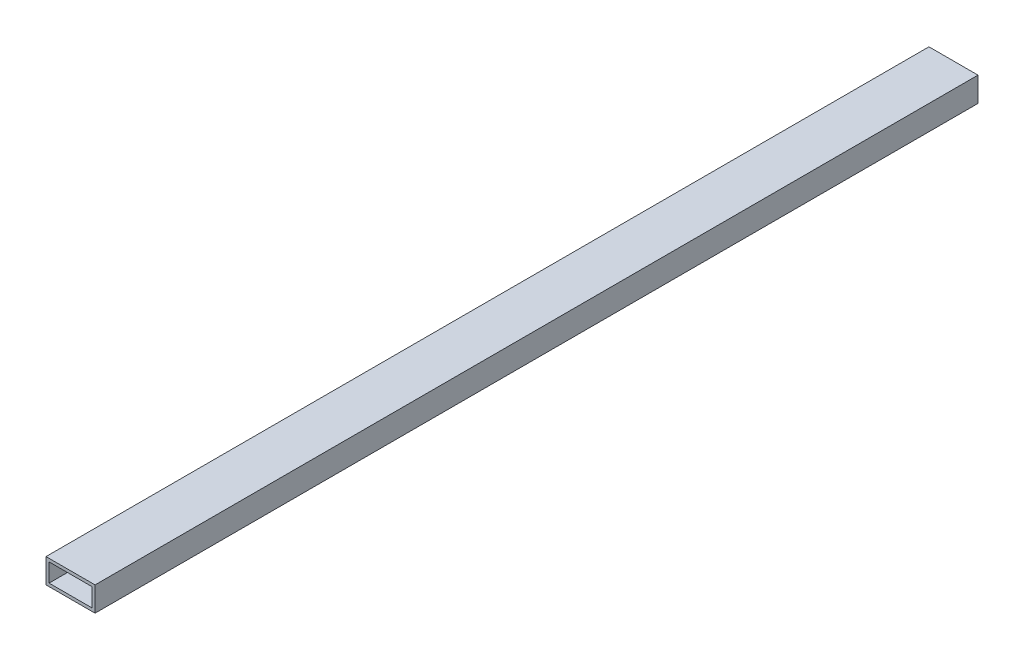
ISO-10303-21;
HEADER;
FILE_DESCRIPTION(('STEP AP214'),'2;1');
FILE_NAME('part.step','',(''),(''),'','','');
FILE_SCHEMA(('AUTOMOTIVE_DESIGN { 1 0 10303 214 1 1 1 1 }'));
ENDSEC;
DATA;
#1=APPLICATION_CONTEXT('core data for automotive mechanical design processes');
#2=APPLICATION_PROTOCOL_DEFINITION('international standard','automotive_design',2000,#1);
#3=PRODUCT_CONTEXT('',#1,'mechanical');
#4=PRODUCT('Part','Part','',(#3));
#5=PRODUCT_RELATED_PRODUCT_CATEGORY('part','',(#4));
#6=PRODUCT_DEFINITION_FORMATION('','',#4);
#7=PRODUCT_DEFINITION_CONTEXT('part definition',#1,'design');
#8=PRODUCT_DEFINITION('design','',#6,#7);
#9=PRODUCT_DEFINITION_SHAPE('','',#8);
#10=(LENGTH_UNIT() NAMED_UNIT(*) SI_UNIT(.MILLI.,.METRE.));
#11=(NAMED_UNIT(*) PLANE_ANGLE_UNIT() SI_UNIT($,.RADIAN.));
#12=(NAMED_UNIT(*) SI_UNIT($,.STERADIAN.) SOLID_ANGLE_UNIT());
#13=UNCERTAINTY_MEASURE_WITH_UNIT(LENGTH_MEASURE(1.E-05),#10,'distance_accuracy_value','');
#14=(GEOMETRIC_REPRESENTATION_CONTEXT(3) GLOBAL_UNCERTAINTY_ASSIGNED_CONTEXT((#13)) GLOBAL_UNIT_ASSIGNED_CONTEXT((#10,
#11,#12)) REPRESENTATION_CONTEXT('',''));
#15=CARTESIAN_POINT('',(0.,0.,0.));
#16=DIRECTION('',(0.,0.,1.));
#17=DIRECTION('',(1.,0.,0.));
#18=AXIS2_PLACEMENT_3D('',#15,#16,#17);
#19=CARTESIAN_POINT('',(0.,0.,457.2));
#20=DIRECTION('',(0.,0.,1.));
#21=DIRECTION('',(1.,0.,0.));
#22=AXIS2_PLACEMENT_3D('',#19,#20,#21);
#23=PLANE('',#22);
#24=DIRECTION('',(0.,-1.,0.));
#25=VECTOR('',#24,1.);
#26=CARTESIAN_POINT('',(-25.4,12.7,457.2));
#27=LINE('',#26,#25);
#28=CARTESIAN_POINT('',(-25.4,12.7,457.2));
#29=VERTEX_POINT('',#28);
#30=CARTESIAN_POINT('',(-25.4,-12.7,457.2));
#31=VERTEX_POINT('',#30);
#32=EDGE_CURVE('E108',#29,#31,#27,.T.);
#33=ORIENTED_EDGE('',*,*,#32,.T.);
#34=DIRECTION('',(1.,0.,0.));
#35=VECTOR('',#34,1.);
#36=CARTESIAN_POINT('',(-25.4,-12.7,457.2));
#37=LINE('',#36,#35);
#38=CARTESIAN_POINT('',(25.4,-12.7,457.2));
#39=VERTEX_POINT('',#38);
#40=EDGE_CURVE('E151',#31,#39,#37,.T.);
#41=ORIENTED_EDGE('',*,*,#40,.T.);
#42=DIRECTION('',(0.,1.,0.));
#43=VECTOR('',#42,1.);
#44=CARTESIAN_POINT('',(25.4,-12.7,457.2));
#45=LINE('',#44,#43);
#46=CARTESIAN_POINT('',(25.4,12.7,457.2));
#47=VERTEX_POINT('',#46);
#48=EDGE_CURVE('E153',#39,#47,#45,.T.);
#49=ORIENTED_EDGE('',*,*,#48,.T.);
#50=DIRECTION('',(-1.,0.,0.));
#51=VECTOR('',#50,1.);
#52=CARTESIAN_POINT('',(25.4,12.7,457.2));
#53=LINE('',#52,#51);
#54=EDGE_CURVE('E55',#47,#29,#53,.T.);
#55=ORIENTED_EDGE('',*,*,#54,.T.);
#56=EDGE_LOOP('',(#33,#41,#49,#55));
#57=FACE_BOUND('',#56,.T.);
#58=DIRECTION('',(1.,0.,0.));
#59=VECTOR('',#58,1.);
#60=CARTESIAN_POINT('',(-22.225,-9.525,457.2));
#61=LINE('',#60,#59);
#62=CARTESIAN_POINT('',(-22.225,-9.525,457.2));
#63=VERTEX_POINT('',#62);
#64=CARTESIAN_POINT('',(22.225,-9.525,457.2));
#65=VERTEX_POINT('',#64);
#66=EDGE_CURVE('E140',#63,#65,#61,.T.);
#67=ORIENTED_EDGE('',*,*,#66,.F.);
#68=DIRECTION('',(0.,-1.,0.));
#69=VECTOR('',#68,1.);
#70=CARTESIAN_POINT('',(-22.225,9.525,457.2));
#71=LINE('',#70,#69);
#72=CARTESIAN_POINT('',(-22.225,9.525,457.2));
#73=VERTEX_POINT('',#72);
#74=EDGE_CURVE('E105',#73,#63,#71,.T.);
#75=ORIENTED_EDGE('',*,*,#74,.F.);
#76=DIRECTION('',(-1.,0.,0.));
#77=VECTOR('',#76,1.);
#78=CARTESIAN_POINT('',(22.225,9.525,457.2));
#79=LINE('',#78,#77);
#80=CARTESIAN_POINT('',(22.225,9.525,457.2));
#81=VERTEX_POINT('',#80);
#82=EDGE_CURVE('E144',#81,#73,#79,.T.);
#83=ORIENTED_EDGE('',*,*,#82,.F.);
#84=DIRECTION('',(0.,1.,0.));
#85=VECTOR('',#84,1.);
#86=CARTESIAN_POINT('',(22.225,-9.525,457.2));
#87=LINE('',#86,#85);
#88=EDGE_CURVE('E142',#65,#81,#87,.T.);
#89=ORIENTED_EDGE('',*,*,#88,.F.);
#90=EDGE_LOOP('',(#67,#75,#83,#89));
#91=FACE_BOUND('',#90,.T.);
#92=ADVANCED_FACE('F32',(#57,#91),#23,.T.);
#93=CARTESIAN_POINT('',(-25.4,12.7,457.2));
#94=DIRECTION('',(1.,0.,0.));
#95=DIRECTION('',(0.,0.,-1.));
#96=AXIS2_PLACEMENT_3D('',#93,#94,#95);
#97=PLANE('',#96);
#98=DIRECTION('',(0.,0.,-1.));
#99=VECTOR('',#98,1.);
#100=CARTESIAN_POINT('',(-25.4,12.7,457.2));
#101=LINE('',#100,#99);
#102=CARTESIAN_POINT('',(-25.4,12.7,-457.2));
#103=VERTEX_POINT('',#102);
#104=EDGE_CURVE('E156',#29,#103,#101,.T.);
#105=ORIENTED_EDGE('',*,*,#104,.T.);
#106=DIRECTION('',(0.,-1.,0.));
#107=VECTOR('',#106,1.);
#108=CARTESIAN_POINT('',(-25.4,12.7,-457.2));
#109=LINE('',#108,#107);
#110=CARTESIAN_POINT('',(-25.4,-12.7,-457.2));
#111=VERTEX_POINT('',#110);
#112=EDGE_CURVE('E127',#103,#111,#109,.T.);
#113=ORIENTED_EDGE('',*,*,#112,.T.);
#114=DIRECTION('',(0.,0.,-1.));
#115=VECTOR('',#114,1.);
#116=CARTESIAN_POINT('',(-25.4,-12.7,457.2));
#117=LINE('',#116,#115);
#118=EDGE_CURVE('E11',#31,#111,#117,.T.);
#119=ORIENTED_EDGE('',*,*,#118,.F.);
#120=ORIENTED_EDGE('',*,*,#32,.F.);
#121=EDGE_LOOP('',(#105,#113,#119,#120));
#122=FACE_BOUND('',#121,.T.);
#123=ADVANCED_FACE('F34',(#122),#97,.F.);
#124=CARTESIAN_POINT('',(-25.4,-12.7,457.2));
#125=DIRECTION('',(0.,1.,0.));
#126=DIRECTION('',(-1.,0.,0.));
#127=AXIS2_PLACEMENT_3D('',#124,#125,#126);
#128=PLANE('',#127);
#129=ORIENTED_EDGE('',*,*,#118,.T.);
#130=DIRECTION('',(1.,0.,0.));
#131=VECTOR('',#130,1.);
#132=CARTESIAN_POINT('',(-25.4,-12.7,-457.2));
#133=LINE('',#132,#131);
#134=CARTESIAN_POINT('',(25.4,-12.7,-457.2));
#135=VERTEX_POINT('',#134);
#136=EDGE_CURVE('E130',#111,#135,#133,.T.);
#137=ORIENTED_EDGE('',*,*,#136,.T.);
#138=DIRECTION('',(0.,0.,-1.));
#139=VECTOR('',#138,1.);
#140=CARTESIAN_POINT('',(25.4,-12.7,457.2));
#141=LINE('',#140,#139);
#142=EDGE_CURVE('E40',#39,#135,#141,.T.);
#143=ORIENTED_EDGE('',*,*,#142,.F.);
#144=ORIENTED_EDGE('',*,*,#40,.F.);
#145=EDGE_LOOP('',(#129,#137,#143,#144));
#146=FACE_BOUND('',#145,.T.);
#147=ADVANCED_FACE('F169',(#146),#128,.F.);
#148=CARTESIAN_POINT('',(25.4,-12.7,457.2));
#149=DIRECTION('',(-1.,0.,0.));
#150=DIRECTION('',(0.,0.,1.));
#151=AXIS2_PLACEMENT_3D('',#148,#149,#150);
#152=PLANE('',#151);
#153=ORIENTED_EDGE('',*,*,#142,.T.);
#154=DIRECTION('',(0.,1.,0.));
#155=VECTOR('',#154,1.);
#156=CARTESIAN_POINT('',(25.4,-12.7,-457.2));
#157=LINE('',#156,#155);
#158=CARTESIAN_POINT('',(25.4,12.7,-457.2));
#159=VERTEX_POINT('',#158);
#160=EDGE_CURVE('E133',#135,#159,#157,.T.);
#161=ORIENTED_EDGE('',*,*,#160,.T.);
#162=DIRECTION('',(0.,0.,-1.));
#163=VECTOR('',#162,1.);
#164=CARTESIAN_POINT('',(25.4,12.7,457.2));
#165=LINE('',#164,#163);
#166=EDGE_CURVE('E158',#47,#159,#165,.T.);
#167=ORIENTED_EDGE('',*,*,#166,.F.);
#168=ORIENTED_EDGE('',*,*,#48,.F.);
#169=EDGE_LOOP('',(#153,#161,#167,#168));
#170=FACE_BOUND('',#169,.T.);
#171=ADVANCED_FACE('F163',(#170),#152,.F.);
#172=CARTESIAN_POINT('',(25.4,12.7,457.2));
#173=DIRECTION('',(0.,-1.,0.));
#174=DIRECTION('',(1.,0.,0.));
#175=AXIS2_PLACEMENT_3D('',#172,#173,#174);
#176=PLANE('',#175);
#177=ORIENTED_EDGE('',*,*,#166,.T.);
#178=DIRECTION('',(-1.,0.,0.));
#179=VECTOR('',#178,1.);
#180=CARTESIAN_POINT('',(25.4,12.7,-457.2));
#181=LINE('',#180,#179);
#182=EDGE_CURVE('E136',#159,#103,#181,.T.);
#183=ORIENTED_EDGE('',*,*,#182,.T.);
#184=ORIENTED_EDGE('',*,*,#104,.F.);
#185=ORIENTED_EDGE('',*,*,#54,.F.);
#186=EDGE_LOOP('',(#177,#183,#184,#185));
#187=FACE_BOUND('',#186,.T.);
#188=ADVANCED_FACE('F174',(#187),#176,.F.);
#189=CARTESIAN_POINT('',(-22.225,9.525,457.2));
#190=DIRECTION('',(1.,0.,0.));
#191=DIRECTION('',(0.,1.,0.));
#192=AXIS2_PLACEMENT_3D('',#189,#190,#191);
#193=PLANE('',#192);
#194=DIRECTION('',(0.,0.,-1.));
#195=VECTOR('',#194,1.);
#196=CARTESIAN_POINT('',(-22.225,-9.525,457.2));
#197=LINE('',#196,#195);
#198=CARTESIAN_POINT('',(-22.225,-9.525,-457.2));
#199=VERTEX_POINT('',#198);
#200=EDGE_CURVE('E97',#63,#199,#197,.T.);
#201=ORIENTED_EDGE('',*,*,#200,.T.);
#202=DIRECTION('',(0.,-1.,0.));
#203=VECTOR('',#202,1.);
#204=CARTESIAN_POINT('',(-22.225,9.525,-457.2));
#205=LINE('',#204,#203);
#206=CARTESIAN_POINT('',(-22.225,9.525,-457.2));
#207=VERTEX_POINT('',#206);
#208=EDGE_CURVE('E102',#207,#199,#205,.T.);
#209=ORIENTED_EDGE('',*,*,#208,.F.);
#210=DIRECTION('',(0.,0.,-1.));
#211=VECTOR('',#210,1.);
#212=CARTESIAN_POINT('',(-22.225,9.525,457.2));
#213=LINE('',#212,#211);
#214=EDGE_CURVE('E146',#73,#207,#213,.T.);
#215=ORIENTED_EDGE('',*,*,#214,.F.);
#216=ORIENTED_EDGE('',*,*,#74,.T.);
#217=EDGE_LOOP('',(#201,#209,#215,#216));
#218=FACE_BOUND('',#217,.T.);
#219=ADVANCED_FACE('F99',(#218),#193,.T.);
#220=CARTESIAN_POINT('',(-22.225,-9.525,457.2));
#221=DIRECTION('',(0.,1.,0.));
#222=DIRECTION('',(0.,0.,1.));
#223=AXIS2_PLACEMENT_3D('',#220,#221,#222);
#224=PLANE('',#223);
#225=DIRECTION('',(0.,0.,-1.));
#226=VECTOR('',#225,1.);
#227=CARTESIAN_POINT('',(22.225,-9.525,457.2));
#228=LINE('',#227,#226);
#229=CARTESIAN_POINT('',(22.225,-9.525,-457.2));
#230=VERTEX_POINT('',#229);
#231=EDGE_CURVE('E109',#65,#230,#228,.T.);
#232=ORIENTED_EDGE('',*,*,#231,.T.);
#233=DIRECTION('',(1.,0.,0.));
#234=VECTOR('',#233,1.);
#235=CARTESIAN_POINT('',(-22.225,-9.525,-457.2));
#236=LINE('',#235,#234);
#237=EDGE_CURVE('E112',#199,#230,#236,.T.);
#238=ORIENTED_EDGE('',*,*,#237,.F.);
#239=ORIENTED_EDGE('',*,*,#200,.F.);
#240=ORIENTED_EDGE('',*,*,#66,.T.);
#241=EDGE_LOOP('',(#232,#238,#239,#240));
#242=FACE_BOUND('',#241,.T.);
#243=ADVANCED_FACE('F113',(#242),#224,.T.);
#244=CARTESIAN_POINT('',(22.225,-9.525,457.2));
#245=DIRECTION('',(-1.,0.,0.));
#246=DIRECTION('',(0.,-1.,0.));
#247=AXIS2_PLACEMENT_3D('',#244,#245,#246);
#248=PLANE('',#247);
#249=DIRECTION('',(0.,0.,-1.));
#250=VECTOR('',#249,1.);
#251=CARTESIAN_POINT('',(22.225,9.525,457.2));
#252=LINE('',#251,#250);
#253=CARTESIAN_POINT('',(22.225,9.525,-457.2));
#254=VERTEX_POINT('',#253);
#255=EDGE_CURVE('E47',#81,#254,#252,.T.);
#256=ORIENTED_EDGE('',*,*,#255,.T.);
#257=DIRECTION('',(0.,1.,0.));
#258=VECTOR('',#257,1.);
#259=CARTESIAN_POINT('',(22.225,-9.525,-457.2));
#260=LINE('',#259,#258);
#261=EDGE_CURVE('E118',#230,#254,#260,.T.);
#262=ORIENTED_EDGE('',*,*,#261,.F.);
#263=ORIENTED_EDGE('',*,*,#231,.F.);
#264=ORIENTED_EDGE('',*,*,#88,.T.);
#265=EDGE_LOOP('',(#256,#262,#263,#264));
#266=FACE_BOUND('',#265,.T.);
#267=ADVANCED_FACE('F192',(#266),#248,.T.);
#268=CARTESIAN_POINT('',(22.225,9.525,457.2));
#269=DIRECTION('',(0.,-1.,0.));
#270=DIRECTION('',(0.,0.,-1.));
#271=AXIS2_PLACEMENT_3D('',#268,#269,#270);
#272=PLANE('',#271);
#273=ORIENTED_EDGE('',*,*,#214,.T.);
#274=DIRECTION('',(-1.,0.,0.));
#275=VECTOR('',#274,1.);
#276=CARTESIAN_POINT('',(22.225,9.525,-457.2));
#277=LINE('',#276,#275);
#278=EDGE_CURVE('E122',#254,#207,#277,.T.);
#279=ORIENTED_EDGE('',*,*,#278,.F.);
#280=ORIENTED_EDGE('',*,*,#255,.F.);
#281=ORIENTED_EDGE('',*,*,#82,.T.);
#282=EDGE_LOOP('',(#273,#279,#280,#281));
#283=FACE_BOUND('',#282,.T.);
#284=ADVANCED_FACE('F195',(#283),#272,.T.);
#285=CARTESIAN_POINT('',(0.,0.,-457.2));
#286=DIRECTION('',(0.,0.,1.));
#287=DIRECTION('',(1.,0.,0.));
#288=AXIS2_PLACEMENT_3D('',#285,#286,#287);
#289=PLANE('',#288);
#290=ORIENTED_EDGE('',*,*,#278,.T.);
#291=ORIENTED_EDGE('',*,*,#208,.T.);
#292=ORIENTED_EDGE('',*,*,#237,.T.);
#293=ORIENTED_EDGE('',*,*,#261,.T.);
#294=EDGE_LOOP('',(#290,#291,#292,#293));
#295=FACE_BOUND('',#294,.T.);
#296=ORIENTED_EDGE('',*,*,#112,.F.);
#297=ORIENTED_EDGE('',*,*,#182,.F.);
#298=ORIENTED_EDGE('',*,*,#160,.F.);
#299=ORIENTED_EDGE('',*,*,#136,.F.);
#300=EDGE_LOOP('',(#296,#297,#298,#299));
#301=FACE_BOUND('',#300,.T.);
#302=ADVANCED_FACE('F120',(#295,#301),#289,.F.);
#303=CLOSED_SHELL('',(#92,#123,#147,#171,#188,#219,#243,#267,#284,#302));
#304=MANIFOLD_SOLID_BREP('B2',#303);
#305=ADVANCED_BREP_SHAPE_REPRESENTATION('',(#18,#304),#14);
#306=SHAPE_DEFINITION_REPRESENTATION(#9,#305);
ENDSEC;
END-ISO-10303-21;
